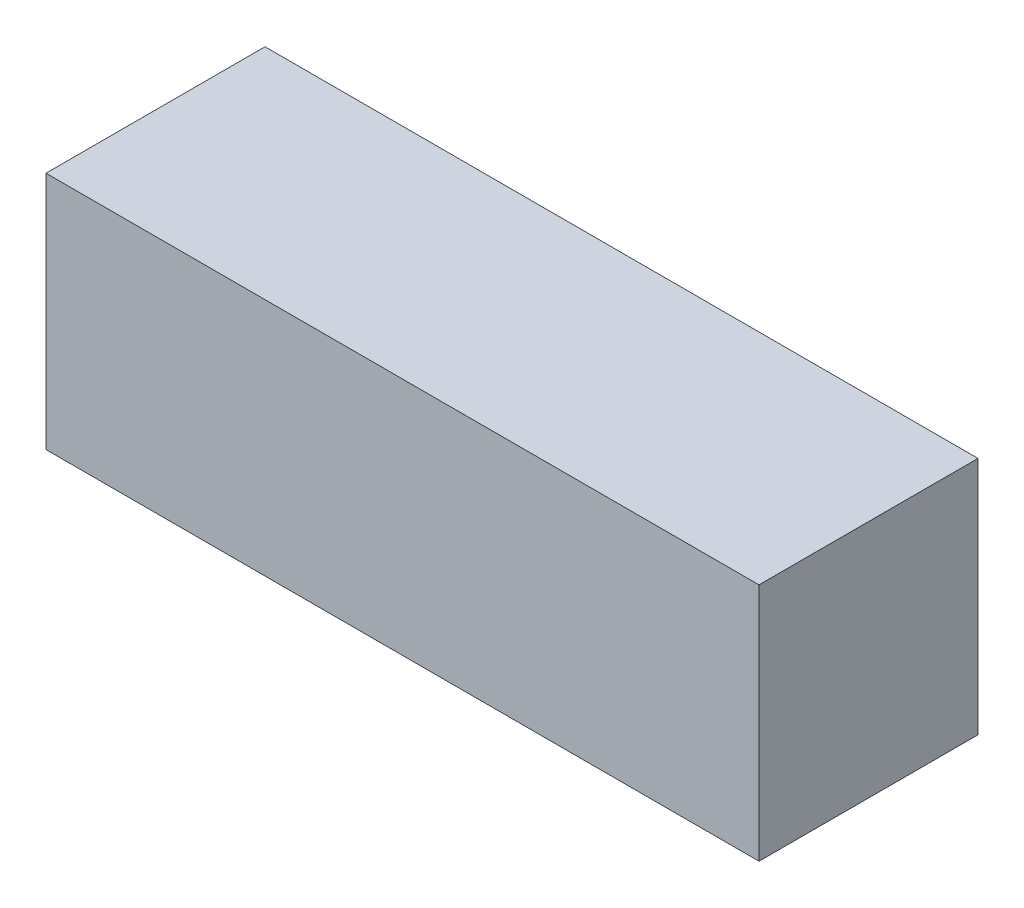
ISO-10303-21;
HEADER;
FILE_DESCRIPTION(('STEP AP214'),'2;1');
FILE_NAME('part.step','',(''),(''),'','','');
FILE_SCHEMA(('AUTOMOTIVE_DESIGN { 1 0 10303 214 1 1 1 1 }'));
ENDSEC;
DATA;
#1=APPLICATION_CONTEXT('core data for automotive mechanical design processes');
#2=APPLICATION_PROTOCOL_DEFINITION('international standard','automotive_design',2000,#1);
#3=PRODUCT_CONTEXT('',#1,'mechanical');
#4=PRODUCT('Part','Part','',(#3));
#5=PRODUCT_RELATED_PRODUCT_CATEGORY('part','',(#4));
#6=PRODUCT_DEFINITION_FORMATION('','',#4);
#7=PRODUCT_DEFINITION_CONTEXT('part definition',#1,'design');
#8=PRODUCT_DEFINITION('design','',#6,#7);
#9=PRODUCT_DEFINITION_SHAPE('','',#8);
#10=(LENGTH_UNIT() NAMED_UNIT(*) SI_UNIT(.MILLI.,.METRE.));
#11=(NAMED_UNIT(*) PLANE_ANGLE_UNIT() SI_UNIT($,.RADIAN.));
#12=(NAMED_UNIT(*) SI_UNIT($,.STERADIAN.) SOLID_ANGLE_UNIT());
#13=UNCERTAINTY_MEASURE_WITH_UNIT(LENGTH_MEASURE(1.E-05),#10,'distance_accuracy_value','');
#14=(GEOMETRIC_REPRESENTATION_CONTEXT(3) GLOBAL_UNCERTAINTY_ASSIGNED_CONTEXT((#13)) GLOBAL_UNIT_ASSIGNED_CONTEXT((#10,
#11,#12)) REPRESENTATION_CONTEXT('',''));
#15=CARTESIAN_POINT('',(0.,0.,0.));
#16=DIRECTION('',(0.,0.,1.));
#17=DIRECTION('',(1.,0.,0.));
#18=AXIS2_PLACEMENT_3D('',#15,#16,#17);
#19=CARTESIAN_POINT('',(70.,-23.5,43.));
#20=DIRECTION('',(-1.,0.,0.));
#21=DIRECTION('',(0.,0.,1.));
#22=AXIS2_PLACEMENT_3D('',#19,#20,#21);
#23=PLANE('',#22);
#24=DIRECTION('',(0.,1.,0.));
#25=VECTOR('',#24,1.);
#26=CARTESIAN_POINT('',(70.,-23.5,0.));
#27=LINE('',#26,#25);
#28=CARTESIAN_POINT('',(70.,-23.5,0.));
#29=VERTEX_POINT('',#28);
#30=CARTESIAN_POINT('',(70.,23.5,0.));
#31=VERTEX_POINT('',#30);
#32=EDGE_CURVE('E110',#29,#31,#27,.T.);
#33=ORIENTED_EDGE('',*,*,#32,.T.);
#34=DIRECTION('',(0.,0.,-1.));
#35=VECTOR('',#34,1.);
#36=CARTESIAN_POINT('',(70.,23.5,43.));
#37=LINE('',#36,#35);
#38=CARTESIAN_POINT('',(70.,23.5,43.));
#39=VERTEX_POINT('',#38);
#40=EDGE_CURVE('E11',#39,#31,#37,.T.);
#41=ORIENTED_EDGE('',*,*,#40,.F.);
#42=DIRECTION('',(0.,1.,0.));
#43=VECTOR('',#42,1.);
#44=CARTESIAN_POINT('',(70.,-23.5,43.));
#45=LINE('',#44,#43);
#46=CARTESIAN_POINT('',(70.,-23.5,43.));
#47=VERTEX_POINT('',#46);
#48=EDGE_CURVE('E94',#47,#39,#45,.T.);
#49=ORIENTED_EDGE('',*,*,#48,.F.);
#50=DIRECTION('',(0.,0.,-1.));
#51=VECTOR('',#50,1.);
#52=CARTESIAN_POINT('',(70.,-23.5,43.));
#53=LINE('',#52,#51);
#54=EDGE_CURVE('E106',#47,#29,#53,.T.);
#55=ORIENTED_EDGE('',*,*,#54,.T.);
#56=EDGE_LOOP('',(#33,#41,#49,#55));
#57=FACE_BOUND('',#56,.T.);
#58=ADVANCED_FACE('F42',(#57),#23,.F.);
#59=CARTESIAN_POINT('',(-70.,23.5,43.));
#60=DIRECTION('',(0.,-1.,0.));
#61=DIRECTION('',(0.,0.,-1.));
#62=AXIS2_PLACEMENT_3D('',#59,#60,#61);
#63=PLANE('',#62);
#64=DIRECTION('',(-1.,0.,0.));
#65=VECTOR('',#64,1.);
#66=CARTESIAN_POINT('',(-70.,23.5,0.));
#67=LINE('',#66,#65);
#68=CARTESIAN_POINT('',(-70.,23.5,0.));
#69=VERTEX_POINT('',#68);
#70=EDGE_CURVE('E99',#31,#69,#67,.T.);
#71=ORIENTED_EDGE('',*,*,#70,.T.);
#72=DIRECTION('',(0.,0.,-1.));
#73=VECTOR('',#72,1.);
#74=CARTESIAN_POINT('',(-70.,23.5,43.));
#75=LINE('',#74,#73);
#76=CARTESIAN_POINT('',(-70.,23.5,43.));
#77=VERTEX_POINT('',#76);
#78=EDGE_CURVE('E51',#77,#69,#75,.T.);
#79=ORIENTED_EDGE('',*,*,#78,.F.);
#80=DIRECTION('',(-1.,0.,0.));
#81=VECTOR('',#80,1.);
#82=CARTESIAN_POINT('',(-70.,23.5,43.));
#83=LINE('',#82,#81);
#84=EDGE_CURVE('E89',#39,#77,#83,.T.);
#85=ORIENTED_EDGE('',*,*,#84,.F.);
#86=ORIENTED_EDGE('',*,*,#40,.T.);
#87=EDGE_LOOP('',(#71,#79,#85,#86));
#88=FACE_BOUND('',#87,.T.);
#89=ADVANCED_FACE('F98',(#88),#63,.F.);
#90=CARTESIAN_POINT('',(-70.,-23.5,43.));
#91=DIRECTION('',(1.,0.,0.));
#92=DIRECTION('',(0.,0.,-1.));
#93=AXIS2_PLACEMENT_3D('',#90,#91,#92);
#94=PLANE('',#93);
#95=DIRECTION('',(0.,-1.,0.));
#96=VECTOR('',#95,1.);
#97=CARTESIAN_POINT('',(-70.,-23.5,0.));
#98=LINE('',#97,#96);
#99=CARTESIAN_POINT('',(-70.,-23.5,0.));
#100=VERTEX_POINT('',#99);
#101=EDGE_CURVE('E76',#69,#100,#98,.T.);
#102=ORIENTED_EDGE('',*,*,#101,.T.);
#103=DIRECTION('',(0.,0.,-1.));
#104=VECTOR('',#103,1.);
#105=CARTESIAN_POINT('',(-70.,-23.5,43.));
#106=LINE('',#105,#104);
#107=CARTESIAN_POINT('',(-70.,-23.5,43.));
#108=VERTEX_POINT('',#107);
#109=EDGE_CURVE('E101',#108,#100,#106,.T.);
#110=ORIENTED_EDGE('',*,*,#109,.F.);
#111=DIRECTION('',(0.,-1.,0.));
#112=VECTOR('',#111,1.);
#113=CARTESIAN_POINT('',(-70.,-23.5,43.));
#114=LINE('',#113,#112);
#115=EDGE_CURVE('E92',#77,#108,#114,.T.);
#116=ORIENTED_EDGE('',*,*,#115,.F.);
#117=ORIENTED_EDGE('',*,*,#78,.T.);
#118=EDGE_LOOP('',(#102,#110,#116,#117));
#119=FACE_BOUND('',#118,.T.);
#120=ADVANCED_FACE('F102',(#119),#94,.F.);
#121=CARTESIAN_POINT('',(-70.,-23.5,43.));
#122=DIRECTION('',(0.,1.,0.));
#123=DIRECTION('',(0.,0.,1.));
#124=AXIS2_PLACEMENT_3D('',#121,#122,#123);
#125=PLANE('',#124);
#126=DIRECTION('',(1.,0.,0.));
#127=VECTOR('',#126,1.);
#128=CARTESIAN_POINT('',(-70.,-23.5,0.));
#129=LINE('',#128,#127);
#130=EDGE_CURVE('E82',#100,#29,#129,.T.);
#131=ORIENTED_EDGE('',*,*,#130,.T.);
#132=ORIENTED_EDGE('',*,*,#54,.F.);
#133=DIRECTION('',(1.,0.,0.));
#134=VECTOR('',#133,1.);
#135=CARTESIAN_POINT('',(-70.,-23.5,43.));
#136=LINE('',#135,#134);
#137=EDGE_CURVE('E59',#108,#47,#136,.T.);
#138=ORIENTED_EDGE('',*,*,#137,.F.);
#139=ORIENTED_EDGE('',*,*,#109,.T.);
#140=EDGE_LOOP('',(#131,#132,#138,#139));
#141=FACE_BOUND('',#140,.T.);
#142=ADVANCED_FACE('F123',(#141),#125,.F.);
#143=CARTESIAN_POINT('',(0.,0.,43.));
#144=DIRECTION('',(0.,0.,-1.));
#145=DIRECTION('',(-1.,0.,0.));
#146=AXIS2_PLACEMENT_3D('',#143,#144,#145);
#147=PLANE('',#146);
#148=ORIENTED_EDGE('',*,*,#48,.T.);
#149=ORIENTED_EDGE('',*,*,#84,.T.);
#150=ORIENTED_EDGE('',*,*,#115,.T.);
#151=ORIENTED_EDGE('',*,*,#137,.T.);
#152=EDGE_LOOP('',(#148,#149,#150,#151));
#153=FACE_BOUND('',#152,.T.);
#154=ADVANCED_FACE('F90',(#153),#147,.F.);
#155=CARTESIAN_POINT('',(0.,0.,0.));
#156=DIRECTION('',(0.,0.,-1.));
#157=DIRECTION('',(-1.,0.,0.));
#158=AXIS2_PLACEMENT_3D('',#155,#156,#157);
#159=PLANE('',#158);
#160=ORIENTED_EDGE('',*,*,#32,.F.);
#161=ORIENTED_EDGE('',*,*,#130,.F.);
#162=ORIENTED_EDGE('',*,*,#101,.F.);
#163=ORIENTED_EDGE('',*,*,#70,.F.);
#164=EDGE_LOOP('',(#160,#161,#162,#163));
#165=FACE_BOUND('',#164,.T.);
#166=ADVANCED_FACE('F126',(#165),#159,.T.);
#167=CLOSED_SHELL('',(#58,#89,#120,#142,#154,#166));
#168=MANIFOLD_SOLID_BREP('B2',#167);
#169=ADVANCED_BREP_SHAPE_REPRESENTATION('',(#18,#168),#14);
#170=SHAPE_DEFINITION_REPRESENTATION(#9,#169);
ENDSEC;
END-ISO-10303-21;
